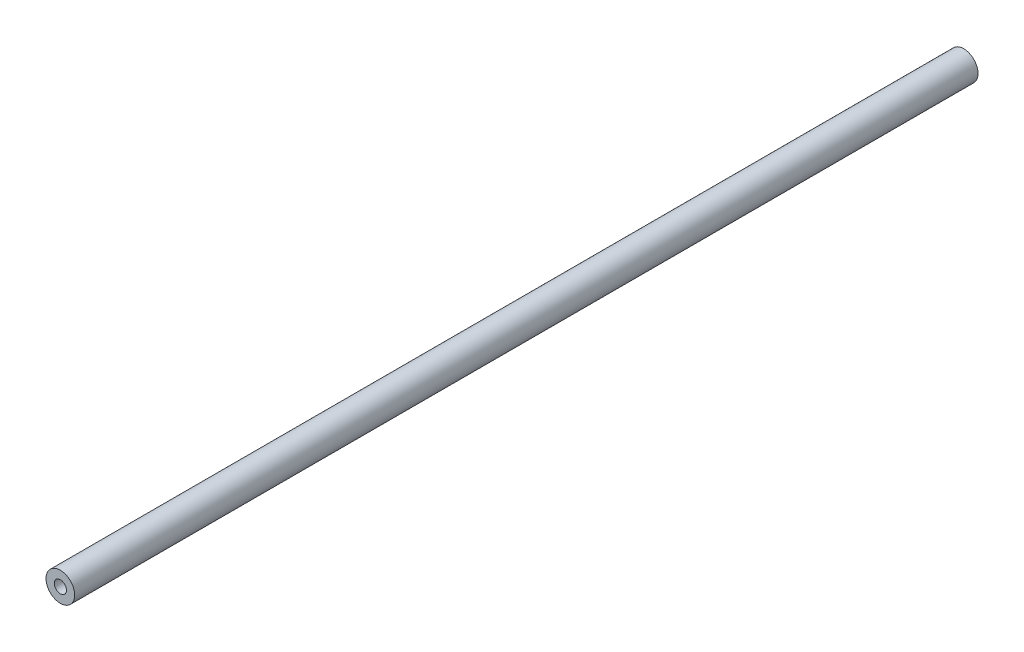
ISO-10303-21;
HEADER;
FILE_DESCRIPTION(('STEP AP214'),'2;1');
FILE_NAME('part.step','',(''),(''),'','','');
FILE_SCHEMA(('AUTOMOTIVE_DESIGN { 1 0 10303 214 1 1 1 1 }'));
ENDSEC;
DATA;
#1=APPLICATION_CONTEXT('core data for automotive mechanical design processes');
#2=APPLICATION_PROTOCOL_DEFINITION('international standard','automotive_design',2000,#1);
#3=PRODUCT_CONTEXT('',#1,'mechanical');
#4=PRODUCT('Part','Part','',(#3));
#5=PRODUCT_RELATED_PRODUCT_CATEGORY('part','',(#4));
#6=PRODUCT_DEFINITION_FORMATION('','',#4);
#7=PRODUCT_DEFINITION_CONTEXT('part definition',#1,'design');
#8=PRODUCT_DEFINITION('design','',#6,#7);
#9=PRODUCT_DEFINITION_SHAPE('','',#8);
#10=(LENGTH_UNIT() NAMED_UNIT(*) SI_UNIT(.MILLI.,.METRE.));
#11=(NAMED_UNIT(*) PLANE_ANGLE_UNIT() SI_UNIT($,.RADIAN.));
#12=(NAMED_UNIT(*) SI_UNIT($,.STERADIAN.) SOLID_ANGLE_UNIT());
#13=UNCERTAINTY_MEASURE_WITH_UNIT(LENGTH_MEASURE(1.E-05),#10,'distance_accuracy_value','');
#14=(GEOMETRIC_REPRESENTATION_CONTEXT(3) GLOBAL_UNCERTAINTY_ASSIGNED_CONTEXT((#13)) GLOBAL_UNIT_ASSIGNED_CONTEXT((#10,
#11,#12)) REPRESENTATION_CONTEXT('',''));
#15=CARTESIAN_POINT('',(0.,0.,0.));
#16=DIRECTION('',(0.,0.,1.));
#17=DIRECTION('',(1.,0.,0.));
#18=AXIS2_PLACEMENT_3D('',#15,#16,#17);
#19=CARTESIAN_POINT('',(0.,0.,150.01875));
#20=DIRECTION('',(0.,0.,-1.));
#21=DIRECTION('',(-1.,0.,0.));
#22=AXIS2_PLACEMENT_3D('',#19,#20,#21);
#23=CYLINDRICAL_SURFACE('',#22,4.7625);
#24=CARTESIAN_POINT('',(0.,0.,150.01875));
#25=DIRECTION('',(0.,0.,1.));
#26=DIRECTION('',(1.,0.,0.));
#27=AXIS2_PLACEMENT_3D('',#24,#25,#26);
#28=CIRCLE('',#27,4.7625);
#29=CARTESIAN_POINT('',(-4.7625,0.,150.01875));
#30=VERTEX_POINT('',#29);
#31=EDGE_CURVE('E11',#30,#30,#28,.T.);
#32=CARTESIAN_POINT('',(0.,0.,-150.01875));
#33=DIRECTION('',(0.,0.,1.));
#34=DIRECTION('',(1.,0.,0.));
#35=AXIS2_PLACEMENT_3D('',#32,#33,#34);
#36=CIRCLE('',#35,4.7625);
#37=CARTESIAN_POINT('',(-4.7625,0.,-150.01875));
#38=VERTEX_POINT('',#37);
#39=EDGE_CURVE('E58',#38,#38,#36,.T.);
#40=CARTESIAN_POINT('',(-4.7625,0.,150.01875));
#41=CARTESIAN_POINT('',(-4.7625,0.,146.893359375));
#42=CARTESIAN_POINT('',(-4.7625,0.,143.76796875));
#43=CARTESIAN_POINT('',(-4.7625,0.,137.5171875));
#44=CARTESIAN_POINT('',(-4.7625,0.,134.391796875));
#45=CARTESIAN_POINT('',(-4.7625,0.,128.141015625));
#46=CARTESIAN_POINT('',(-4.7625,0.,125.015625));
#47=CARTESIAN_POINT('',(-4.7625,0.,118.76484375));
#48=CARTESIAN_POINT('',(-4.7625,0.,115.639453125));
#49=CARTESIAN_POINT('',(-4.7625,0.,109.388671875));
#50=CARTESIAN_POINT('',(-4.7625,0.,106.26328125));
#51=CARTESIAN_POINT('',(-4.7625,0.,100.0125));
#52=CARTESIAN_POINT('',(-4.7625,0.,96.887109375));
#53=CARTESIAN_POINT('',(-4.7625,0.,90.636328125));
#54=CARTESIAN_POINT('',(-4.7625,0.,87.5109375));
#55=CARTESIAN_POINT('',(-4.7625,0.,81.26015625));
#56=CARTESIAN_POINT('',(-4.7625,0.,78.134765625));
#57=CARTESIAN_POINT('',(-4.7625,0.,71.883984375));
#58=CARTESIAN_POINT('',(-4.7625,0.,68.75859375));
#59=CARTESIAN_POINT('',(-4.7625,0.,62.5078125));
#60=CARTESIAN_POINT('',(-4.7625,0.,59.382421875));
#61=CARTESIAN_POINT('',(-4.7625,0.,53.131640625));
#62=CARTESIAN_POINT('',(-4.7625,0.,50.00625));
#63=CARTESIAN_POINT('',(-4.7625,0.,43.75546875));
#64=CARTESIAN_POINT('',(-4.7625,0.,40.630078125));
#65=CARTESIAN_POINT('',(-4.7625,0.,34.379296875));
#66=CARTESIAN_POINT('',(-4.7625,0.,31.25390625));
#67=CARTESIAN_POINT('',(-4.7625,0.,25.003125));
#68=CARTESIAN_POINT('',(-4.7625,0.,21.877734375));
#69=CARTESIAN_POINT('',(-4.7625,0.,15.626953125));
#70=CARTESIAN_POINT('',(-4.7625,0.,12.5015625));
#71=CARTESIAN_POINT('',(-4.7625,0.,6.25078124999998));
#72=CARTESIAN_POINT('',(-4.7625,0.,3.12539062499997));
#73=CARTESIAN_POINT('',(-4.7625,0.,-3.12539062500003));
#74=CARTESIAN_POINT('',(-4.7625,0.,-6.25078125000003));
#75=CARTESIAN_POINT('',(-4.7625,0.,-12.5015625));
#76=CARTESIAN_POINT('',(-4.7625,0.,-15.626953125));
#77=CARTESIAN_POINT('',(-4.7625,0.,-21.877734375));
#78=CARTESIAN_POINT('',(-4.7625,0.,-25.003125));
#79=CARTESIAN_POINT('',(-4.7625,0.,-31.25390625));
#80=CARTESIAN_POINT('',(-4.7625,0.,-34.3792968750001));
#81=CARTESIAN_POINT('',(-4.7625,0.,-40.630078125));
#82=CARTESIAN_POINT('',(-4.7625,0.,-43.75546875));
#83=CARTESIAN_POINT('',(-4.7625,0.,-50.00625));
#84=CARTESIAN_POINT('',(-4.7625,0.,-53.131640625));
#85=CARTESIAN_POINT('',(-4.7625,0.,-59.382421875));
#86=CARTESIAN_POINT('',(-4.7625,0.,-62.5078125));
#87=CARTESIAN_POINT('',(-4.7625,0.,-68.75859375));
#88=CARTESIAN_POINT('',(-4.7625,0.,-71.883984375));
#89=CARTESIAN_POINT('',(-4.7625,0.,-78.134765625));
#90=CARTESIAN_POINT('',(-4.7625,0.,-81.2601562500001));
#91=CARTESIAN_POINT('',(-4.7625,0.,-87.5109375000001));
#92=CARTESIAN_POINT('',(-4.7625,0.,-90.636328125));
#93=CARTESIAN_POINT('',(-4.7625,0.,-96.887109375));
#94=CARTESIAN_POINT('',(-4.7625,0.,-100.0125));
#95=CARTESIAN_POINT('',(-4.7625,0.,-106.26328125));
#96=CARTESIAN_POINT('',(-4.7625,0.,-109.388671875));
#97=CARTESIAN_POINT('',(-4.7625,0.,-115.639453125));
#98=CARTESIAN_POINT('',(-4.7625,0.,-118.76484375));
#99=CARTESIAN_POINT('',(-4.7625,0.,-125.015625));
#100=CARTESIAN_POINT('',(-4.7625,0.,-128.141015625));
#101=CARTESIAN_POINT('',(-4.7625,0.,-134.391796875));
#102=CARTESIAN_POINT('',(-4.7625,0.,-137.5171875));
#103=CARTESIAN_POINT('',(-4.7625,0.,-143.76796875));
#104=CARTESIAN_POINT('',(-4.7625,0.,-146.893359375));
#105=CARTESIAN_POINT('',(-4.7625,0.,-150.01875));
#106=B_SPLINE_CURVE_WITH_KNOTS('',3,(#40,#41,#42,#43,#44,#45,#46,#47,#48,#49,#50,#51,#52,#53,
#54,#55,#56,#57,#58,#59,#60,#61,#62,#63,#64,#65,#66,#67,#68,#69,#70,#71,#72,#73,#74,#75,#76,#77,
#78,#79,#80,#81,#82,#83,#84,#85,#86,#87,#88,#89,#90,#91,#92,#93,#94,#95,#96,#97,#98,#99,#100,
#101,#102,#103,#104,#105),.UNSPECIFIED.,.F.,.F.,(4,2,2,2,2,2,2,2,2,2,2,2,2,2,2,2,2,2,2,2,2,2,2,
2,2,2,2,2,2,2,2,2,4),(0.,9.37617187499998,18.75234375,28.128515625,37.5046875,46.880859375,
56.25703125,65.633203125,75.009375,84.385546875,93.76171875,103.137890625,112.5140625,
121.890234375,131.26640625,140.642578125,150.01875,159.394921875,168.77109375,178.147265625,
187.5234375,196.899609375,206.27578125,215.651953125,225.028125,234.404296875,243.78046875,
253.156640625,262.5328125,271.908984375,281.28515625,290.661328125,300.0375),.UNSPECIFIED.);
#107=EDGE_CURVE('BSEAM55',#30,#38,#106,.T.);
#108=ORIENTED_EDGE('',*,*,#31,.F.);
#109=ORIENTED_EDGE('',*,*,#39,.T.);
#110=ORIENTED_EDGE('',*,*,#107,.T.);
#111=ORIENTED_EDGE('',*,*,#107,.F.);
#112=EDGE_LOOP('',(#108,#110,#109,#111));
#113=FACE_BOUND('',#112,.T.);
#114=ADVANCED_FACE('F55',(#113),#23,.T.);
#115=CARTESIAN_POINT('',(0.,0.,150.01875));
#116=DIRECTION('',(0.,0.,1.));
#117=DIRECTION('',(1.,0.,0.));
#118=AXIS2_PLACEMENT_3D('',#115,#116,#117);
#119=PLANE('',#118);
#120=CARTESIAN_POINT('',(0.,0.,150.01875));
#121=DIRECTION('',(0.,0.,1.));
#122=DIRECTION('',(1.,0.,0.));
#123=AXIS2_PLACEMENT_3D('',#120,#121,#122);
#124=CIRCLE('',#123,2.01929999999999);
#125=CARTESIAN_POINT('',(2.01929999999999,0.,150.01875));
#126=VERTEX_POINT('',#125);
#127=EDGE_CURVE('E81',#126,#126,#124,.T.);
#128=ORIENTED_EDGE('',*,*,#127,.F.);
#129=EDGE_LOOP('',(#128));
#130=FACE_BOUND('',#129,.T.);
#131=ORIENTED_EDGE('',*,*,#31,.T.);
#132=EDGE_LOOP('',(#131));
#133=FACE_BOUND('',#132,.T.);
#134=ADVANCED_FACE('F103',(#130,#133),#119,.T.);
#135=CARTESIAN_POINT('',(0.,0.,-150.01875));
#136=DIRECTION('',(0.,0.,1.));
#137=DIRECTION('',(1.,0.,0.));
#138=AXIS2_PLACEMENT_3D('',#135,#136,#137);
#139=PLANE('',#138);
#140=CARTESIAN_POINT('',(0.,0.,-150.01875));
#141=DIRECTION('',(0.,0.,-1.));
#142=DIRECTION('',(-1.,0.,0.));
#143=AXIS2_PLACEMENT_3D('',#140,#141,#142);
#144=CIRCLE('',#143,2.01929999999999);
#145=CARTESIAN_POINT('',(-2.01929999999999,0.,-150.01875));
#146=VERTEX_POINT('',#145);
#147=EDGE_CURVE('E80',#146,#146,#144,.T.);
#148=ORIENTED_EDGE('',*,*,#147,.F.);
#149=EDGE_LOOP('',(#148));
#150=FACE_BOUND('',#149,.T.);
#151=ORIENTED_EDGE('',*,*,#39,.F.);
#152=EDGE_LOOP('',(#151));
#153=FACE_BOUND('',#152,.T.);
#154=ADVANCED_FACE('F100',(#150,#153),#139,.F.);
#155=CARTESIAN_POINT('',(0.,0.,-138.08075));
#156=DIRECTION('',(0.,0.,-1.));
#157=DIRECTION('',(-1.,0.,0.));
#158=AXIS2_PLACEMENT_3D('',#155,#156,#157);
#159=CONICAL_SURFACE('',#158,2.01929999999999,1.02974425867665);
#160=CARTESIAN_POINT('',(0.,0.,-136.867432151998));
#161=VERTEX_POINT('',#160);
#162=VERTEX_LOOP('',#161);
#163=FACE_BOUND('',#162,.T.);
#164=CARTESIAN_POINT('',(0.,0.,-138.08075));
#165=DIRECTION('',(0.,0.,-1.));
#166=DIRECTION('',(-1.,0.,0.));
#167=AXIS2_PLACEMENT_3D('',#164,#165,#166);
#168=CIRCLE('',#167,2.01929999999999);
#169=CARTESIAN_POINT('',(-2.01929999999999,0.,-138.08075));
#170=VERTEX_POINT('',#169);
#171=EDGE_CURVE('E86',#170,#170,#168,.T.);
#172=ORIENTED_EDGE('',*,*,#171,.T.);
#173=EDGE_LOOP('',(#172));
#174=FACE_BOUND('',#173,.T.);
#175=ADVANCED_FACE('F102',(#163,#174),#159,.F.);
#176=CARTESIAN_POINT('',(0.,0.,-150.01875));
#177=DIRECTION('',(0.,0.,-1.));
#178=DIRECTION('',(-1.,0.,0.));
#179=AXIS2_PLACEMENT_3D('',#176,#177,#178);
#180=CYLINDRICAL_SURFACE('',#179,2.01929999999999);
#181=ORIENTED_EDGE('',*,*,#171,.F.);
#182=EDGE_LOOP('',(#181));
#183=FACE_BOUND('',#182,.T.);
#184=ORIENTED_EDGE('',*,*,#147,.T.);
#185=EDGE_LOOP('',(#184));
#186=FACE_BOUND('',#185,.T.);
#187=ADVANCED_FACE('F73',(#183,#186),#180,.F.);
#188=CARTESIAN_POINT('',(0.,0.,138.08075));
#189=DIRECTION('',(0.,0.,1.));
#190=DIRECTION('',(1.,0.,0.));
#191=AXIS2_PLACEMENT_3D('',#188,#189,#190);
#192=CONICAL_SURFACE('',#191,2.01929999999999,1.02974425867665);
#193=CARTESIAN_POINT('',(0.,0.,136.867432151998));
#194=VERTEX_POINT('',#193);
#195=VERTEX_LOOP('',#194);
#196=FACE_BOUND('',#195,.T.);
#197=CARTESIAN_POINT('',(0.,0.,138.08075));
#198=DIRECTION('',(0.,0.,1.));
#199=DIRECTION('',(1.,0.,0.));
#200=AXIS2_PLACEMENT_3D('',#197,#198,#199);
#201=CIRCLE('',#200,2.01929999999999);
#202=CARTESIAN_POINT('',(2.01929999999999,0.,138.08075));
#203=VERTEX_POINT('',#202);
#204=EDGE_CURVE('E77',#203,#203,#201,.T.);
#205=ORIENTED_EDGE('',*,*,#204,.T.);
#206=EDGE_LOOP('',(#205));
#207=FACE_BOUND('',#206,.T.);
#208=ADVANCED_FACE('F69',(#196,#207),#192,.F.);
#209=CARTESIAN_POINT('',(0.,0.,150.01875));
#210=DIRECTION('',(0.,0.,1.));
#211=DIRECTION('',(1.,0.,0.));
#212=AXIS2_PLACEMENT_3D('',#209,#210,#211);
#213=CYLINDRICAL_SURFACE('',#212,2.01929999999999);
#214=ORIENTED_EDGE('',*,*,#204,.F.);
#215=EDGE_LOOP('',(#214));
#216=FACE_BOUND('',#215,.T.);
#217=ORIENTED_EDGE('',*,*,#127,.T.);
#218=EDGE_LOOP('',(#217));
#219=FACE_BOUND('',#218,.T.);
#220=ADVANCED_FACE('F72',(#216,#219),#213,.F.);
#221=CLOSED_SHELL('',(#114,#134,#154,#175,#187,#208,#220));
#222=MANIFOLD_SOLID_BREP('B2',#221);
#223=ADVANCED_BREP_SHAPE_REPRESENTATION('',(#18,#222),#14);
#224=SHAPE_DEFINITION_REPRESENTATION(#9,#223);
ENDSEC;
END-ISO-10303-21;
